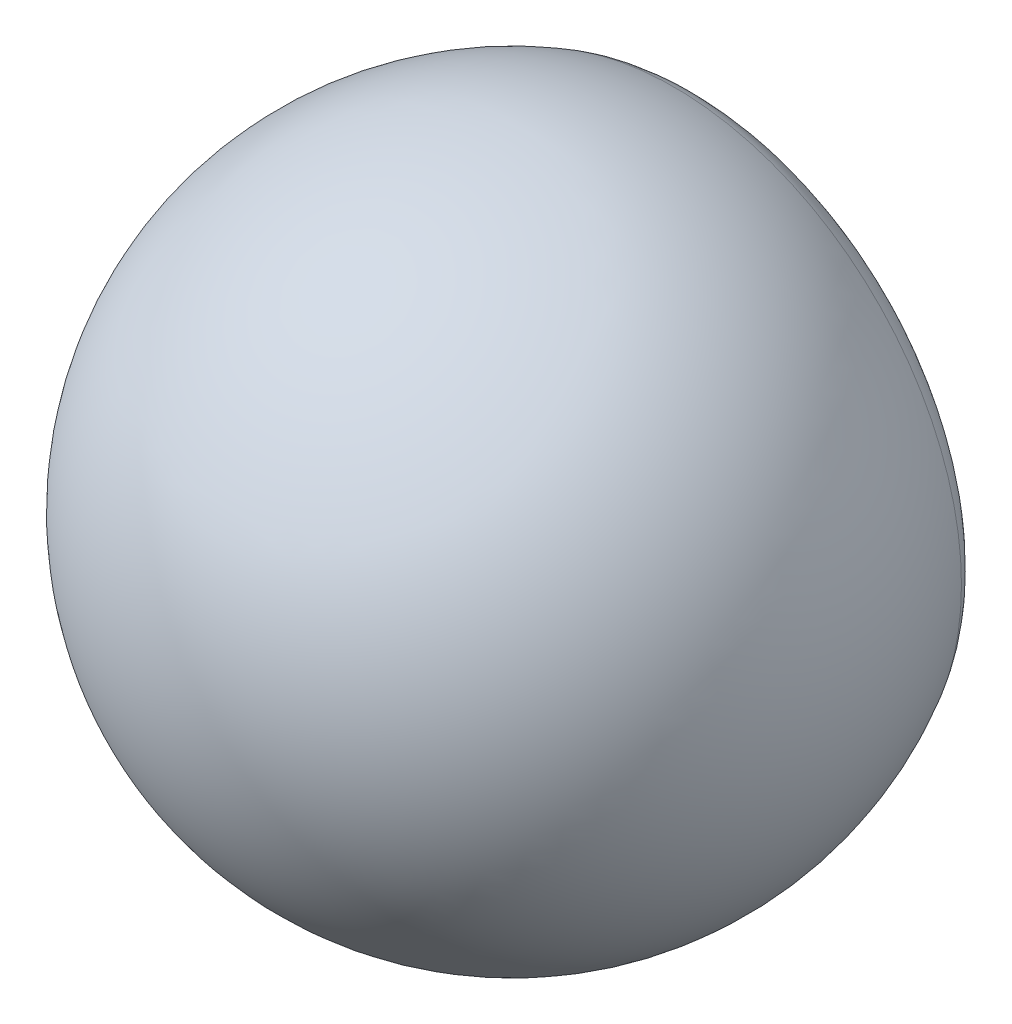
ISO-10303-21;
HEADER;
FILE_DESCRIPTION(('STEP AP214'),'2;1');
FILE_NAME('part.step','',(''),(''),'','','');
FILE_SCHEMA(('AUTOMOTIVE_DESIGN { 1 0 10303 214 1 1 1 1 }'));
ENDSEC;
DATA;
#1=APPLICATION_CONTEXT('core data for automotive mechanical design processes');
#2=APPLICATION_PROTOCOL_DEFINITION('international standard','automotive_design',2000,#1);
#3=PRODUCT_CONTEXT('',#1,'mechanical');
#4=PRODUCT('Part','Part','',(#3));
#5=PRODUCT_RELATED_PRODUCT_CATEGORY('part','',(#4));
#6=PRODUCT_DEFINITION_FORMATION('','',#4);
#7=PRODUCT_DEFINITION_CONTEXT('part definition',#1,'design');
#8=PRODUCT_DEFINITION('design','',#6,#7);
#9=PRODUCT_DEFINITION_SHAPE('','',#8);
#10=(LENGTH_UNIT() NAMED_UNIT(*) SI_UNIT(.MILLI.,.METRE.));
#11=(NAMED_UNIT(*) PLANE_ANGLE_UNIT() SI_UNIT($,.RADIAN.));
#12=(NAMED_UNIT(*) SI_UNIT($,.STERADIAN.) SOLID_ANGLE_UNIT());
#13=UNCERTAINTY_MEASURE_WITH_UNIT(LENGTH_MEASURE(1.E-05),#10,'distance_accuracy_value','');
#14=(GEOMETRIC_REPRESENTATION_CONTEXT(3) GLOBAL_UNCERTAINTY_ASSIGNED_CONTEXT((#13)) GLOBAL_UNIT_ASSIGNED_CONTEXT((#10,
#11,#12)) REPRESENTATION_CONTEXT('',''));
#15=CARTESIAN_POINT('',(0.,0.,0.));
#16=DIRECTION('',(0.,0.,1.));
#17=DIRECTION('',(1.,0.,0.));
#18=AXIS2_PLACEMENT_3D('',#15,#16,#17);
#19=CARTESIAN_POINT('',(0.,0.,85.8820218366121));
#20=DIRECTION('',(0.,0.,1.));
#21=DIRECTION('',(1.,0.,0.));
#22=AXIS2_PLACEMENT_3D('',#19,#20,#21);
#23=SPHERICAL_SURFACE('',#22,5.08);
#24=CARTESIAN_POINT('',(0.,0.,87.3944348018011));
#25=DIRECTION('',(0.,0.,1.));
#26=DIRECTION('',(1.,0.,0.));
#27=AXIS2_PLACEMENT_3D('',#24,#25,#26);
#28=CIRCLE('',#27,4.849639885881);
#29=CARTESIAN_POINT('',(4.849639885881,0.,87.3944348018011));
#30=VERTEX_POINT('',#29);
#31=EDGE_CURVE('E10',#30,#30,#28,.T.);
#32=ORIENTED_EDGE('',*,*,#31,.F.);
#33=EDGE_LOOP('',(#32));
#34=FACE_BOUND('',#33,.T.);
#35=ADVANCED_FACE('F41',(#34),#23,.F.);
#36=CARTESIAN_POINT('',(0.,0.,88.0942644261579));
#37=DIRECTION('',(0.,0.,1.));
#38=DIRECTION('',(1.,0.,0.));
#39=AXIS2_PLACEMENT_3D('',#36,#37,#38);
#40=TOROIDAL_SURFACE('',#39,7.0936841632832,2.35063740761284);
#41=ORIENTED_EDGE('',*,*,#31,.T.);
#42=EDGE_LOOP('',(#41));
#43=FACE_BOUND('',#42,.T.);
#44=CARTESIAN_POINT('',(0.,0.,86.9428911190143));
#45=DIRECTION('',(0.,0.,1.));
#46=DIRECTION('',(1.,0.,0.));
#47=AXIS2_PLACEMENT_3D('',#44,#45,#46);
#48=CIRCLE('',#47,9.14303423822551);
#49=CARTESIAN_POINT('',(9.14303423822551,0.,86.9428911190143));
#50=VERTEX_POINT('',#49);
#51=EDGE_CURVE('E47',#50,#50,#48,.T.);
#52=ORIENTED_EDGE('',*,*,#51,.F.);
#53=EDGE_LOOP('',(#52));
#54=FACE_BOUND('',#53,.T.);
#55=ADVANCED_FACE('F55',(#43,#54),#40,.T.);
#56=CARTESIAN_POINT('',(0.,0.,92.0796638436495));
#57=DIRECTION('',(0.,0.,1.));
#58=DIRECTION('',(1.,0.,0.));
#59=AXIS2_PLACEMENT_3D('',#56,#57,#58);
#60=SPHERICAL_SURFACE('',#59,10.4872069258655);
#61=ORIENTED_EDGE('',*,*,#51,.T.);
#62=EDGE_LOOP('',(#61));
#63=FACE_BOUND('',#62,.T.);
#64=ADVANCED_FACE('F53',(#63),#60,.T.);
#65=CLOSED_SHELL('',(#35,#55,#64));
#66=MANIFOLD_SOLID_BREP('B2',#65);
#67=ADVANCED_BREP_SHAPE_REPRESENTATION('',(#18,#66),#14);
#68=SHAPE_DEFINITION_REPRESENTATION(#9,#67);
ENDSEC;
END-ISO-10303-21;
